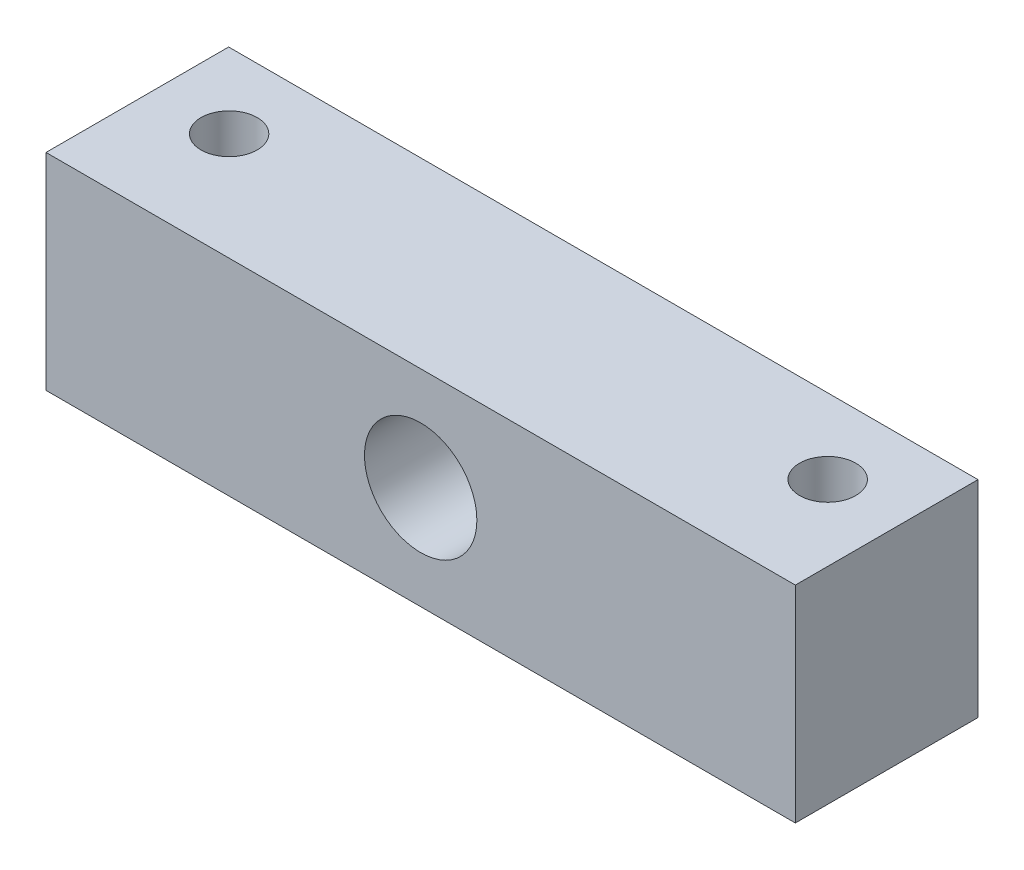
ISO-10303-21;
HEADER;
FILE_DESCRIPTION(('STEP AP214'),'2;1');
FILE_NAME('part.step','',(''),(''),'','','');
FILE_SCHEMA(('AUTOMOTIVE_DESIGN { 1 0 10303 214 1 1 1 1 }'));
ENDSEC;
DATA;
#1=APPLICATION_CONTEXT('core data for automotive mechanical design processes');
#2=APPLICATION_PROTOCOL_DEFINITION('international standard','automotive_design',2000,#1);
#3=PRODUCT_CONTEXT('',#1,'mechanical');
#4=PRODUCT('Part','Part','',(#3));
#5=PRODUCT_RELATED_PRODUCT_CATEGORY('part','',(#4));
#6=PRODUCT_DEFINITION_FORMATION('','',#4);
#7=PRODUCT_DEFINITION_CONTEXT('part definition',#1,'design');
#8=PRODUCT_DEFINITION('design','',#6,#7);
#9=PRODUCT_DEFINITION_SHAPE('','',#8);
#10=(LENGTH_UNIT() NAMED_UNIT(*) SI_UNIT(.MILLI.,.METRE.));
#11=(NAMED_UNIT(*) PLANE_ANGLE_UNIT() SI_UNIT($,.RADIAN.));
#12=(NAMED_UNIT(*) SI_UNIT($,.STERADIAN.) SOLID_ANGLE_UNIT());
#13=UNCERTAINTY_MEASURE_WITH_UNIT(LENGTH_MEASURE(1.E-05),#10,'distance_accuracy_value','');
#14=(GEOMETRIC_REPRESENTATION_CONTEXT(3) GLOBAL_UNCERTAINTY_ASSIGNED_CONTEXT((#13)) GLOBAL_UNIT_ASSIGNED_CONTEXT((#10,
#11,#12)) REPRESENTATION_CONTEXT('',''));
#15=CARTESIAN_POINT('',(0.,0.,0.));
#16=DIRECTION('',(0.,0.,1.));
#17=DIRECTION('',(1.,0.,0.));
#18=AXIS2_PLACEMENT_3D('',#15,#16,#17);
#19=CARTESIAN_POINT('',(0.,11.,0.));
#20=DIRECTION('',(0.,1.,0.));
#21=DIRECTION('',(0.,0.,1.));
#22=AXIS2_PLACEMENT_3D('',#19,#20,#21);
#23=PLANE('',#22);
#24=CARTESIAN_POINT('',(-15.9760563031056,11.,-0.874999999999995));
#25=DIRECTION('',(0.,1.,0.));
#26=DIRECTION('',(0.,0.,1.));
#27=AXIS2_PLACEMENT_3D('',#24,#25,#26);
#28=CIRCLE('',#27,1.5);
#29=CARTESIAN_POINT('',(-15.9760563031056,11.,0.625000000000005));
#30=VERTEX_POINT('',#29);
#31=EDGE_CURVE('E102',#30,#30,#28,.T.);
#32=ORIENTED_EDGE('',*,*,#31,.F.);
#33=EDGE_LOOP('',(#32));
#34=FACE_BOUND('',#33,.T.);
#35=DIRECTION('',(0.,0.,1.));
#36=VECTOR('',#35,1.);
#37=CARTESIAN_POINT('',(-20.,11.,4.875));
#38=LINE('',#37,#36);
#39=CARTESIAN_POINT('',(-20.,11.,-4.875));
#40=VERTEX_POINT('',#39);
#41=CARTESIAN_POINT('',(-20.,11.,4.875));
#42=VERTEX_POINT('',#41);
#43=EDGE_CURVE('E87',#40,#42,#38,.T.);
#44=ORIENTED_EDGE('',*,*,#43,.T.);
#45=DIRECTION('',(1.,0.,0.));
#46=VECTOR('',#45,1.);
#47=CARTESIAN_POINT('',(20.,11.,4.875));
#48=LINE('',#47,#46);
#49=CARTESIAN_POINT('',(20.,11.,4.875));
#50=VERTEX_POINT('',#49);
#51=EDGE_CURVE('E82',#42,#50,#48,.T.);
#52=ORIENTED_EDGE('',*,*,#51,.T.);
#53=DIRECTION('',(0.,0.,-1.));
#54=VECTOR('',#53,1.);
#55=CARTESIAN_POINT('',(20.,11.,4.875));
#56=LINE('',#55,#54);
#57=CARTESIAN_POINT('',(20.,11.,-4.875));
#58=VERTEX_POINT('',#57);
#59=EDGE_CURVE('E85',#50,#58,#56,.T.);
#60=ORIENTED_EDGE('',*,*,#59,.T.);
#61=DIRECTION('',(-1.,0.,0.));
#62=VECTOR('',#61,1.);
#63=CARTESIAN_POINT('',(20.,11.,-4.875));
#64=LINE('',#63,#62);
#65=EDGE_CURVE('E52',#58,#40,#64,.T.);
#66=ORIENTED_EDGE('',*,*,#65,.T.);
#67=EDGE_LOOP('',(#44,#52,#60,#66));
#68=FACE_BOUND('',#67,.T.);
#69=CARTESIAN_POINT('',(15.9760563031056,11.,-0.874999999999999));
#70=DIRECTION('',(0.,1.,0.));
#71=DIRECTION('',(0.,0.,-1.));
#72=AXIS2_PLACEMENT_3D('',#69,#70,#71);
#73=CIRCLE('',#72,1.5);
#74=CARTESIAN_POINT('',(15.9760563031056,11.,-2.375));
#75=VERTEX_POINT('',#74);
#76=EDGE_CURVE('E117',#75,#75,#73,.T.);
#77=ORIENTED_EDGE('',*,*,#76,.F.);
#78=EDGE_LOOP('',(#77));
#79=FACE_BOUND('',#78,.T.);
#80=ADVANCED_FACE('F35',(#34,#68,#79),#23,.T.);
#81=CARTESIAN_POINT('',(0.,0.,0.));
#82=DIRECTION('',(0.,1.,0.));
#83=DIRECTION('',(0.,0.,1.));
#84=AXIS2_PLACEMENT_3D('',#81,#82,#83);
#85=PLANE('',#84);
#86=DIRECTION('',(0.,0.,1.));
#87=VECTOR('',#86,1.);
#88=CARTESIAN_POINT('',(-20.,0.,4.875));
#89=LINE('',#88,#87);
#90=CARTESIAN_POINT('',(-20.,0.,-4.875));
#91=VERTEX_POINT('',#90);
#92=CARTESIAN_POINT('',(-20.,0.,4.875));
#93=VERTEX_POINT('',#92);
#94=EDGE_CURVE('E99',#91,#93,#89,.T.);
#95=ORIENTED_EDGE('',*,*,#94,.F.);
#96=DIRECTION('',(-1.,0.,0.));
#97=VECTOR('',#96,1.);
#98=CARTESIAN_POINT('',(20.,0.,-4.875));
#99=LINE('',#98,#97);
#100=CARTESIAN_POINT('',(20.,0.,-4.875));
#101=VERTEX_POINT('',#100);
#102=EDGE_CURVE('E75',#101,#91,#99,.T.);
#103=ORIENTED_EDGE('',*,*,#102,.F.);
#104=DIRECTION('',(0.,0.,-1.));
#105=VECTOR('',#104,1.);
#106=CARTESIAN_POINT('',(20.,0.,4.875));
#107=LINE('',#106,#105);
#108=CARTESIAN_POINT('',(20.,0.,4.875));
#109=VERTEX_POINT('',#108);
#110=EDGE_CURVE('E69',#109,#101,#107,.T.);
#111=ORIENTED_EDGE('',*,*,#110,.F.);
#112=DIRECTION('',(1.,0.,0.));
#113=VECTOR('',#112,1.);
#114=CARTESIAN_POINT('',(20.,0.,4.875));
#115=LINE('',#114,#113);
#116=EDGE_CURVE('E91',#93,#109,#115,.T.);
#117=ORIENTED_EDGE('',*,*,#116,.F.);
#118=EDGE_LOOP('',(#95,#103,#111,#117));
#119=FACE_BOUND('',#118,.T.);
#120=CARTESIAN_POINT('',(-15.9760563031056,0.,-0.874999999999995));
#121=DIRECTION('',(0.,1.,0.));
#122=DIRECTION('',(0.,0.,1.));
#123=AXIS2_PLACEMENT_3D('',#120,#121,#122);
#124=CIRCLE('',#123,1.5);
#125=CARTESIAN_POINT('',(-15.9760563031056,0.,0.625000000000005));
#126=VERTEX_POINT('',#125);
#127=EDGE_CURVE('E114',#126,#126,#124,.T.);
#128=ORIENTED_EDGE('',*,*,#127,.T.);
#129=EDGE_LOOP('',(#128));
#130=FACE_BOUND('',#129,.T.);
#131=CARTESIAN_POINT('',(15.9760563031056,0.,-0.874999999999999));
#132=DIRECTION('',(0.,1.,0.));
#133=DIRECTION('',(0.,0.,-1.));
#134=AXIS2_PLACEMENT_3D('',#131,#132,#133);
#135=CIRCLE('',#134,1.5);
#136=CARTESIAN_POINT('',(15.9760563031056,0.,-2.375));
#137=VERTEX_POINT('',#136);
#138=EDGE_CURVE('E120',#137,#137,#135,.T.);
#139=ORIENTED_EDGE('',*,*,#138,.T.);
#140=EDGE_LOOP('',(#139));
#141=FACE_BOUND('',#140,.T.);
#142=ADVANCED_FACE('F110',(#119,#130,#141),#85,.F.);
#143=CARTESIAN_POINT('',(-20.,11.,4.875));
#144=DIRECTION('',(1.,0.,0.));
#145=DIRECTION('',(0.,0.,-1.));
#146=AXIS2_PLACEMENT_3D('',#143,#144,#145);
#147=PLANE('',#146);
#148=ORIENTED_EDGE('',*,*,#94,.T.);
#149=DIRECTION('',(0.,-1.,0.));
#150=VECTOR('',#149,1.);
#151=CARTESIAN_POINT('',(-20.,11.,4.875));
#152=LINE('',#151,#150);
#153=EDGE_CURVE('E11',#42,#93,#152,.T.);
#154=ORIENTED_EDGE('',*,*,#153,.F.);
#155=ORIENTED_EDGE('',*,*,#43,.F.);
#156=DIRECTION('',(0.,-1.,0.));
#157=VECTOR('',#156,1.);
#158=CARTESIAN_POINT('',(-20.,11.,-4.875));
#159=LINE('',#158,#157);
#160=EDGE_CURVE('E95',#40,#91,#159,.T.);
#161=ORIENTED_EDGE('',*,*,#160,.T.);
#162=EDGE_LOOP('',(#148,#154,#155,#161));
#163=FACE_BOUND('',#162,.T.);
#164=ADVANCED_FACE('F37',(#163),#147,.F.);
#165=CARTESIAN_POINT('',(20.,11.,4.875));
#166=DIRECTION('',(0.,0.,-1.));
#167=DIRECTION('',(-1.,0.,0.));
#168=AXIS2_PLACEMENT_3D('',#165,#166,#167);
#169=PLANE('',#168);
#170=CARTESIAN_POINT('',(0.,5.49999999999999,4.875));
#171=DIRECTION('',(0.,0.,1.));
#172=DIRECTION('',(1.,0.,0.));
#173=AXIS2_PLACEMENT_3D('',#170,#171,#172);
#174=CIRCLE('',#173,3.);
#175=CARTESIAN_POINT('',(3.,5.49999999999999,4.875));
#176=VERTEX_POINT('',#175);
#177=EDGE_CURVE('E128',#176,#176,#174,.T.);
#178=ORIENTED_EDGE('',*,*,#177,.F.);
#179=EDGE_LOOP('',(#178));
#180=FACE_BOUND('',#179,.T.);
#181=ORIENTED_EDGE('',*,*,#116,.T.);
#182=DIRECTION('',(0.,-1.,0.));
#183=VECTOR('',#182,1.);
#184=CARTESIAN_POINT('',(20.,11.,4.875));
#185=LINE('',#184,#183);
#186=EDGE_CURVE('E44',#50,#109,#185,.T.);
#187=ORIENTED_EDGE('',*,*,#186,.F.);
#188=ORIENTED_EDGE('',*,*,#51,.F.);
#189=ORIENTED_EDGE('',*,*,#153,.T.);
#190=EDGE_LOOP('',(#181,#187,#188,#189));
#191=FACE_BOUND('',#190,.T.);
#192=ADVANCED_FACE('F90',(#180,#191),#169,.F.);
#193=CARTESIAN_POINT('',(20.,11.,4.875));
#194=DIRECTION('',(-1.,0.,0.));
#195=DIRECTION('',(0.,0.,1.));
#196=AXIS2_PLACEMENT_3D('',#193,#194,#195);
#197=PLANE('',#196);
#198=ORIENTED_EDGE('',*,*,#110,.T.);
#199=DIRECTION('',(0.,-1.,0.));
#200=VECTOR('',#199,1.);
#201=CARTESIAN_POINT('',(20.,11.,-4.875));
#202=LINE('',#201,#200);
#203=EDGE_CURVE('E92',#58,#101,#202,.T.);
#204=ORIENTED_EDGE('',*,*,#203,.F.);
#205=ORIENTED_EDGE('',*,*,#59,.F.);
#206=ORIENTED_EDGE('',*,*,#186,.T.);
#207=EDGE_LOOP('',(#198,#204,#205,#206));
#208=FACE_BOUND('',#207,.T.);
#209=ADVANCED_FACE('F93',(#208),#197,.F.);
#210=CARTESIAN_POINT('',(20.,11.,-4.875));
#211=DIRECTION('',(0.,0.,1.));
#212=DIRECTION('',(1.,0.,0.));
#213=AXIS2_PLACEMENT_3D('',#210,#211,#212);
#214=PLANE('',#213);
#215=CARTESIAN_POINT('',(0.,5.49999999999999,-4.875));
#216=DIRECTION('',(0.,0.,1.));
#217=DIRECTION('',(1.,0.,0.));
#218=AXIS2_PLACEMENT_3D('',#215,#216,#217);
#219=CIRCLE('',#218,3.);
#220=CARTESIAN_POINT('',(3.,5.49999999999999,-4.875));
#221=VERTEX_POINT('',#220);
#222=EDGE_CURVE('E123',#221,#221,#219,.F.);
#223=ORIENTED_EDGE('',*,*,#222,.F.);
#224=EDGE_LOOP('',(#223));
#225=FACE_BOUND('',#224,.T.);
#226=ORIENTED_EDGE('',*,*,#102,.T.);
#227=ORIENTED_EDGE('',*,*,#160,.F.);
#228=ORIENTED_EDGE('',*,*,#65,.F.);
#229=ORIENTED_EDGE('',*,*,#203,.T.);
#230=EDGE_LOOP('',(#226,#227,#228,#229));
#231=FACE_BOUND('',#230,.T.);
#232=ADVANCED_FACE('F107',(#225,#231),#214,.F.);
#233=CARTESIAN_POINT('',(-15.9760563031056,11.,-0.874999999999995));
#234=DIRECTION('',(0.,-1.,0.));
#235=DIRECTION('',(0.,0.,-1.));
#236=AXIS2_PLACEMENT_3D('',#233,#234,#235);
#237=CYLINDRICAL_SURFACE('',#236,1.5);
#238=ORIENTED_EDGE('',*,*,#31,.T.);
#239=EDGE_LOOP('',(#238));
#240=FACE_BOUND('',#239,.T.);
#241=ORIENTED_EDGE('',*,*,#127,.F.);
#242=EDGE_LOOP('',(#241));
#243=FACE_BOUND('',#242,.T.);
#244=ADVANCED_FACE('F150',(#240,#243),#237,.F.);
#245=CARTESIAN_POINT('',(15.9760563031056,11.,-0.874999999999999));
#246=DIRECTION('',(0.,-1.,0.));
#247=DIRECTION('',(0.,0.,-1.));
#248=AXIS2_PLACEMENT_3D('',#245,#246,#247);
#249=CYLINDRICAL_SURFACE('',#248,1.5);
#250=ORIENTED_EDGE('',*,*,#76,.T.);
#251=EDGE_LOOP('',(#250));
#252=FACE_BOUND('',#251,.T.);
#253=ORIENTED_EDGE('',*,*,#138,.F.);
#254=EDGE_LOOP('',(#253));
#255=FACE_BOUND('',#254,.T.);
#256=ADVANCED_FACE('F158',(#252,#255),#249,.F.);
#257=CARTESIAN_POINT('',(0.,5.49999999999999,-4.876));
#258=DIRECTION('',(0.,0.,1.));
#259=DIRECTION('',(1.,0.,0.));
#260=AXIS2_PLACEMENT_3D('',#257,#258,#259);
#261=CYLINDRICAL_SURFACE('',#260,3.);
#262=ORIENTED_EDGE('',*,*,#177,.T.);
#263=EDGE_LOOP('',(#262));
#264=FACE_BOUND('',#263,.T.);
#265=ORIENTED_EDGE('',*,*,#222,.T.);
#266=EDGE_LOOP('',(#265));
#267=FACE_BOUND('',#266,.T.);
#268=ADVANCED_FACE('F132',(#264,#267),#261,.F.);
#269=CLOSED_SHELL('',(#80,#142,#164,#192,#209,#232,#244,#256,#268));
#270=MANIFOLD_SOLID_BREP('B2',#269);
#271=ADVANCED_BREP_SHAPE_REPRESENTATION('',(#18,#270),#14);
#272=SHAPE_DEFINITION_REPRESENTATION(#9,#271);
ENDSEC;
END-ISO-10303-21;
